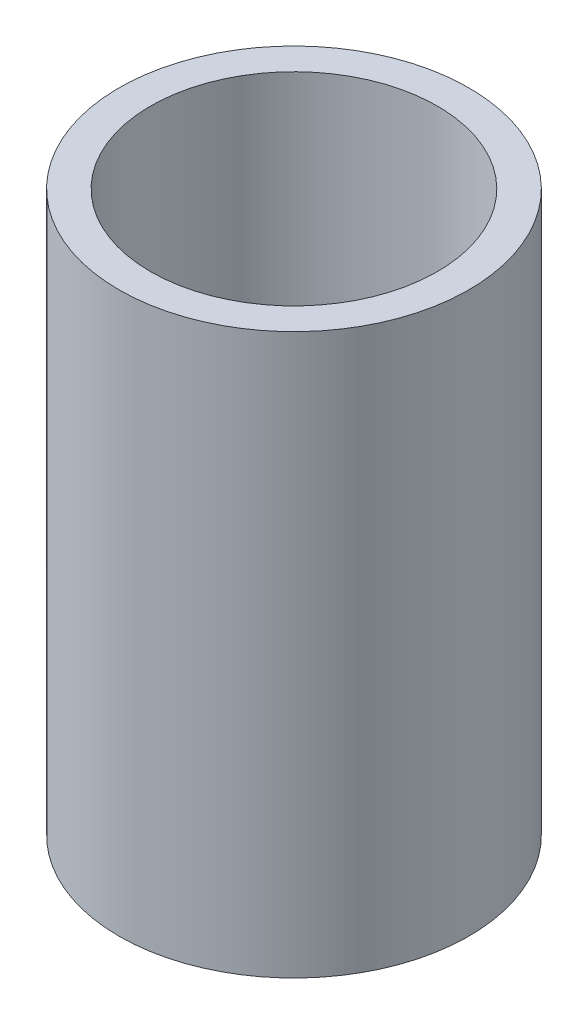
ISO-10303-21;
HEADER;
FILE_DESCRIPTION(('STEP AP214'),'2;1');
FILE_NAME('part.step','',(''),(''),'','','');
FILE_SCHEMA(('AUTOMOTIVE_DESIGN { 1 0 10303 214 1 1 1 1 }'));
ENDSEC;
DATA;
#1=APPLICATION_CONTEXT('core data for automotive mechanical design processes');
#2=APPLICATION_PROTOCOL_DEFINITION('international standard','automotive_design',2000,#1);
#3=PRODUCT_CONTEXT('',#1,'mechanical');
#4=PRODUCT('Part','Part','',(#3));
#5=PRODUCT_RELATED_PRODUCT_CATEGORY('part','',(#4));
#6=PRODUCT_DEFINITION_FORMATION('','',#4);
#7=PRODUCT_DEFINITION_CONTEXT('part definition',#1,'design');
#8=PRODUCT_DEFINITION('design','',#6,#7);
#9=PRODUCT_DEFINITION_SHAPE('','',#8);
#10=(LENGTH_UNIT() NAMED_UNIT(*) SI_UNIT(.MILLI.,.METRE.));
#11=(NAMED_UNIT(*) PLANE_ANGLE_UNIT() SI_UNIT($,.RADIAN.));
#12=(NAMED_UNIT(*) SI_UNIT($,.STERADIAN.) SOLID_ANGLE_UNIT());
#13=UNCERTAINTY_MEASURE_WITH_UNIT(LENGTH_MEASURE(1.E-05),#10,'distance_accuracy_value','');
#14=(GEOMETRIC_REPRESENTATION_CONTEXT(3) GLOBAL_UNCERTAINTY_ASSIGNED_CONTEXT((#13)) GLOBAL_UNIT_ASSIGNED_CONTEXT((#10,
#11,#12)) REPRESENTATION_CONTEXT('',''));
#15=CARTESIAN_POINT('',(0.,0.,0.));
#16=DIRECTION('',(0.,0.,1.));
#17=DIRECTION('',(1.,0.,0.));
#18=AXIS2_PLACEMENT_3D('',#15,#16,#17);
#19=CARTESIAN_POINT('',(0.,16.,0.));
#20=DIRECTION('',(0.,1.,0.));
#21=DIRECTION('',(0.,0.,1.));
#22=AXIS2_PLACEMENT_3D('',#19,#20,#21);
#23=PLANE('',#22);
#24=CARTESIAN_POINT('',(0.,16.,0.));
#25=DIRECTION('',(0.,1.,0.));
#26=DIRECTION('',(0.,0.,1.));
#27=AXIS2_PLACEMENT_3D('',#24,#25,#26);
#28=CIRCLE('',#27,5.);
#29=CARTESIAN_POINT('',(0.,16.,5.));
#30=VERTEX_POINT('',#29);
#31=EDGE_CURVE('E10',#30,#30,#28,.T.);
#32=ORIENTED_EDGE('',*,*,#31,.T.);
#33=EDGE_LOOP('',(#32));
#34=FACE_BOUND('',#33,.T.);
#35=CARTESIAN_POINT('',(0.,16.,0.));
#36=DIRECTION('',(0.,1.,0.));
#37=DIRECTION('',(0.,0.,1.));
#38=AXIS2_PLACEMENT_3D('',#35,#36,#37);
#39=CIRCLE('',#38,4.1);
#40=CARTESIAN_POINT('',(0.,16.,4.1));
#41=VERTEX_POINT('',#40);
#42=EDGE_CURVE('E52',#41,#41,#39,.T.);
#43=ORIENTED_EDGE('',*,*,#42,.F.);
#44=EDGE_LOOP('',(#43));
#45=FACE_BOUND('',#44,.T.);
#46=ADVANCED_FACE('F41',(#34,#45),#23,.T.);
#47=CARTESIAN_POINT('',(0.,0.,0.));
#48=DIRECTION('',(0.,1.,0.));
#49=DIRECTION('',(0.,0.,1.));
#50=AXIS2_PLACEMENT_3D('',#47,#48,#49);
#51=PLANE('',#50);
#52=CARTESIAN_POINT('',(0.,0.,0.));
#53=DIRECTION('',(0.,1.,0.));
#54=DIRECTION('',(0.,0.,1.));
#55=AXIS2_PLACEMENT_3D('',#52,#53,#54);
#56=CIRCLE('',#55,5.);
#57=CARTESIAN_POINT('',(0.,0.,5.));
#58=VERTEX_POINT('',#57);
#59=EDGE_CURVE('E45',#58,#58,#56,.T.);
#60=ORIENTED_EDGE('',*,*,#59,.F.);
#61=EDGE_LOOP('',(#60));
#62=FACE_BOUND('',#61,.T.);
#63=CARTESIAN_POINT('',(0.,0.,0.));
#64=DIRECTION('',(0.,1.,0.));
#65=DIRECTION('',(0.,0.,1.));
#66=AXIS2_PLACEMENT_3D('',#63,#64,#65);
#67=CIRCLE('',#66,4.1);
#68=CARTESIAN_POINT('',(0.,0.,4.1));
#69=VERTEX_POINT('',#68);
#70=EDGE_CURVE('E54',#69,#69,#67,.T.);
#71=ORIENTED_EDGE('',*,*,#70,.T.);
#72=EDGE_LOOP('',(#71));
#73=FACE_BOUND('',#72,.T.);
#74=ADVANCED_FACE('F64',(#62,#73),#51,.F.);
#75=CARTESIAN_POINT('',(0.,16.,0.));
#76=DIRECTION('',(0.,-1.,0.));
#77=DIRECTION('',(0.,0.,-1.));
#78=AXIS2_PLACEMENT_3D('',#75,#76,#77);
#79=CYLINDRICAL_SURFACE('',#78,5.);
#80=ORIENTED_EDGE('',*,*,#31,.F.);
#81=EDGE_LOOP('',(#80));
#82=FACE_BOUND('',#81,.T.);
#83=ORIENTED_EDGE('',*,*,#59,.T.);
#84=EDGE_LOOP('',(#83));
#85=FACE_BOUND('',#84,.T.);
#86=ADVANCED_FACE('F43',(#82,#85),#79,.T.);
#87=CARTESIAN_POINT('',(0.,16.,0.));
#88=DIRECTION('',(0.,-1.,0.));
#89=DIRECTION('',(0.,0.,-1.));
#90=AXIS2_PLACEMENT_3D('',#87,#88,#89);
#91=CYLINDRICAL_SURFACE('',#90,4.1);
#92=ORIENTED_EDGE('',*,*,#42,.T.);
#93=EDGE_LOOP('',(#92));
#94=FACE_BOUND('',#93,.T.);
#95=ORIENTED_EDGE('',*,*,#70,.F.);
#96=EDGE_LOOP('',(#95));
#97=FACE_BOUND('',#96,.T.);
#98=ADVANCED_FACE('F60',(#94,#97),#91,.F.);
#99=CLOSED_SHELL('',(#46,#74,#86,#98));
#100=MANIFOLD_SOLID_BREP('B2',#99);
#101=ADVANCED_BREP_SHAPE_REPRESENTATION('',(#18,#100),#14);
#102=SHAPE_DEFINITION_REPRESENTATION(#9,#101);
ENDSEC;
END-ISO-10303-21;
